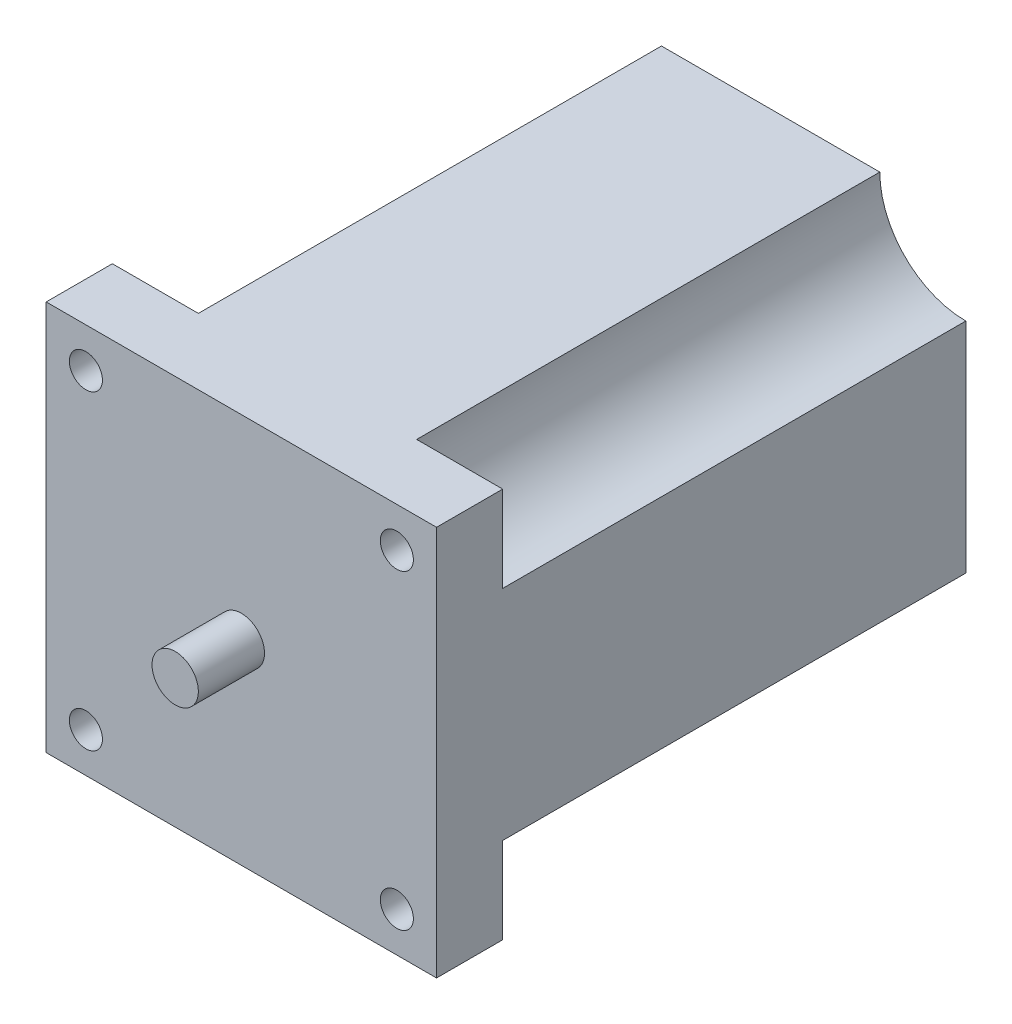
ISO-10303-21;
HEADER;
FILE_DESCRIPTION(('STEP AP214'),'2;1');
FILE_NAME('part.step','',(''),(''),'','','');
FILE_SCHEMA(('AUTOMOTIVE_DESIGN { 1 0 10303 214 1 1 1 1 }'));
ENDSEC;
DATA;
#1=APPLICATION_CONTEXT('core data for automotive mechanical design processes');
#2=APPLICATION_PROTOCOL_DEFINITION('international standard','automotive_design',2000,#1);
#3=PRODUCT_CONTEXT('',#1,'mechanical');
#4=PRODUCT('Part','Part','',(#3));
#5=PRODUCT_RELATED_PRODUCT_CATEGORY('part','',(#4));
#6=PRODUCT_DEFINITION_FORMATION('','',#4);
#7=PRODUCT_DEFINITION_CONTEXT('part definition',#1,'design');
#8=PRODUCT_DEFINITION('design','',#6,#7);
#9=PRODUCT_DEFINITION_SHAPE('','',#8);
#10=(LENGTH_UNIT() NAMED_UNIT(*) SI_UNIT(.MILLI.,.METRE.));
#11=(NAMED_UNIT(*) PLANE_ANGLE_UNIT() SI_UNIT($,.RADIAN.));
#12=(NAMED_UNIT(*) SI_UNIT($,.STERADIAN.) SOLID_ANGLE_UNIT());
#13=UNCERTAINTY_MEASURE_WITH_UNIT(LENGTH_MEASURE(1.E-05),#10,'distance_accuracy_value','');
#14=(GEOMETRIC_REPRESENTATION_CONTEXT(3) GLOBAL_UNCERTAINTY_ASSIGNED_CONTEXT((#13)) GLOBAL_UNIT_ASSIGNED_CONTEXT((#10,
#11,#12)) REPRESENTATION_CONTEXT('',''));
#15=CARTESIAN_POINT('',(0.,0.,0.));
#16=DIRECTION('',(0.,0.,1.));
#17=DIRECTION('',(1.,0.,0.));
#18=AXIS2_PLACEMENT_3D('',#15,#16,#17);
#19=CARTESIAN_POINT('',(0.,0.,0.));
#20=DIRECTION('',(0.,0.,-1.));
#21=DIRECTION('',(-1.,0.,0.));
#22=AXIS2_PLACEMENT_3D('',#19,#20,#21);
#23=PLANE('',#22);
#24=CARTESIAN_POINT('',(23.5,23.5,0.));
#25=DIRECTION('',(0.,0.,1.));
#26=DIRECTION('',(1.,0.,0.));
#27=AXIS2_PLACEMENT_3D('',#24,#25,#26);
#28=CIRCLE('',#27,2.5);
#29=CARTESIAN_POINT('',(26.,23.5,0.));
#30=VERTEX_POINT('',#29);
#31=EDGE_CURVE('E167',#30,#30,#28,.T.);
#32=ORIENTED_EDGE('',*,*,#31,.T.);
#33=EDGE_LOOP('',(#32));
#34=FACE_BOUND('',#33,.T.);
#35=CARTESIAN_POINT('',(29.5,29.5,0.));
#36=DIRECTION('',(0.,0.,1.));
#37=DIRECTION('',(-1.,0.,0.));
#38=AXIS2_PLACEMENT_3D('',#35,#36,#37);
#39=CIRCLE('',#38,13.);
#40=CARTESIAN_POINT('',(16.5,29.5,0.));
#41=VERTEX_POINT('',#40);
#42=CARTESIAN_POINT('',(29.5,16.5,0.));
#43=VERTEX_POINT('',#42);
#44=EDGE_CURVE('E59',#41,#43,#39,.T.);
#45=ORIENTED_EDGE('',*,*,#44,.F.);
#46=DIRECTION('',(-1.,0.,0.));
#47=VECTOR('',#46,1.);
#48=CARTESIAN_POINT('',(-29.5,29.5,0.));
#49=LINE('',#48,#47);
#50=CARTESIAN_POINT('',(29.5,29.5,0.));
#51=VERTEX_POINT('',#50);
#52=EDGE_CURVE('E194',#51,#41,#49,.T.);
#53=ORIENTED_EDGE('',*,*,#52,.F.);
#54=DIRECTION('',(0.,1.,0.));
#55=VECTOR('',#54,1.);
#56=CARTESIAN_POINT('',(29.5,-29.5,0.));
#57=LINE('',#56,#55);
#58=EDGE_CURVE('E178',#43,#51,#57,.T.);
#59=ORIENTED_EDGE('',*,*,#58,.F.);
#60=EDGE_LOOP('',(#45,#53,#59));
#61=FACE_BOUND('',#60,.T.);
#62=ADVANCED_FACE('F36',(#34,#61),#23,.T.);
#63=CARTESIAN_POINT('',(-23.5,23.5,0.));
#64=DIRECTION('',(0.,0.,1.));
#65=DIRECTION('',(1.,0.,0.));
#66=AXIS2_PLACEMENT_3D('',#63,#64,#65);
#67=CIRCLE('',#66,2.5);
#68=CARTESIAN_POINT('',(-21.,23.5,0.));
#69=VERTEX_POINT('',#68);
#70=EDGE_CURVE('E151',#69,#69,#67,.T.);
#71=ORIENTED_EDGE('',*,*,#70,.T.);
#72=EDGE_LOOP('',(#71));
#73=FACE_BOUND('',#72,.T.);
#74=CARTESIAN_POINT('',(-29.5,29.5,0.));
#75=DIRECTION('',(0.,0.,1.));
#76=DIRECTION('',(1.,0.,0.));
#77=AXIS2_PLACEMENT_3D('',#74,#75,#76);
#78=CIRCLE('',#77,13.);
#79=CARTESIAN_POINT('',(-29.5,16.5,0.));
#80=VERTEX_POINT('',#79);
#81=CARTESIAN_POINT('',(-16.5,29.5,0.));
#82=VERTEX_POINT('',#81);
#83=EDGE_CURVE('E145',#80,#82,#78,.T.);
#84=ORIENTED_EDGE('',*,*,#83,.F.);
#85=DIRECTION('',(0.,-1.,0.));
#86=VECTOR('',#85,1.);
#87=CARTESIAN_POINT('',(-29.5,-29.5,0.));
#88=LINE('',#87,#86);
#89=CARTESIAN_POINT('',(-29.5,29.5,0.));
#90=VERTEX_POINT('',#89);
#91=EDGE_CURVE('E197',#90,#80,#88,.T.);
#92=ORIENTED_EDGE('',*,*,#91,.F.);
#93=EDGE_CURVE('E51',#82,#90,#49,.T.);
#94=ORIENTED_EDGE('',*,*,#93,.F.);
#95=EDGE_LOOP('',(#84,#92,#94));
#96=FACE_BOUND('',#95,.T.);
#97=ADVANCED_FACE('F217',(#73,#96),#23,.T.);
#98=CARTESIAN_POINT('',(-23.5,-23.5,0.));
#99=DIRECTION('',(0.,0.,1.));
#100=DIRECTION('',(1.,0.,0.));
#101=AXIS2_PLACEMENT_3D('',#98,#99,#100);
#102=CIRCLE('',#101,2.5);
#103=CARTESIAN_POINT('',(-21.,-23.5,0.));
#104=VERTEX_POINT('',#103);
#105=EDGE_CURVE('E160',#104,#104,#102,.T.);
#106=ORIENTED_EDGE('',*,*,#105,.T.);
#107=EDGE_LOOP('',(#106));
#108=FACE_BOUND('',#107,.T.);
#109=CARTESIAN_POINT('',(-29.5,-29.5,0.));
#110=DIRECTION('',(0.,0.,1.));
#111=DIRECTION('',(-1.,0.,0.));
#112=AXIS2_PLACEMENT_3D('',#109,#110,#111);
#113=CIRCLE('',#112,13.);
#114=CARTESIAN_POINT('',(-16.5,-29.5,0.));
#115=VERTEX_POINT('',#114);
#116=CARTESIAN_POINT('',(-29.5,-16.5,0.));
#117=VERTEX_POINT('',#116);
#118=EDGE_CURVE('E243',#115,#117,#113,.T.);
#119=ORIENTED_EDGE('',*,*,#118,.F.);
#120=DIRECTION('',(1.,0.,0.));
#121=VECTOR('',#120,1.);
#122=CARTESIAN_POINT('',(-29.5,-29.5,0.));
#123=LINE('',#122,#121);
#124=CARTESIAN_POINT('',(-29.5,-29.5,0.));
#125=VERTEX_POINT('',#124);
#126=EDGE_CURVE('E185',#125,#115,#123,.T.);
#127=ORIENTED_EDGE('',*,*,#126,.F.);
#128=EDGE_CURVE('E196',#117,#125,#88,.T.);
#129=ORIENTED_EDGE('',*,*,#128,.F.);
#130=EDGE_LOOP('',(#119,#127,#129));
#131=FACE_BOUND('',#130,.T.);
#132=ADVANCED_FACE('F224',(#108,#131),#23,.T.);
#133=CARTESIAN_POINT('',(23.5,-23.5,0.));
#134=DIRECTION('',(0.,0.,1.));
#135=DIRECTION('',(1.,0.,0.));
#136=AXIS2_PLACEMENT_3D('',#133,#134,#135);
#137=CIRCLE('',#136,2.5);
#138=CARTESIAN_POINT('',(26.,-23.5,0.));
#139=VERTEX_POINT('',#138);
#140=EDGE_CURVE('E175',#139,#139,#137,.T.);
#141=ORIENTED_EDGE('',*,*,#140,.T.);
#142=EDGE_LOOP('',(#141));
#143=FACE_BOUND('',#142,.T.);
#144=CARTESIAN_POINT('',(29.5,-29.5,0.));
#145=DIRECTION('',(0.,0.,1.));
#146=DIRECTION('',(1.,0.,0.));
#147=AXIS2_PLACEMENT_3D('',#144,#145,#146);
#148=CIRCLE('',#147,13.);
#149=CARTESIAN_POINT('',(29.5,-16.5,0.));
#150=VERTEX_POINT('',#149);
#151=CARTESIAN_POINT('',(16.5,-29.5,0.));
#152=VERTEX_POINT('',#151);
#153=EDGE_CURVE('E239',#150,#152,#148,.T.);
#154=ORIENTED_EDGE('',*,*,#153,.F.);
#155=CARTESIAN_POINT('',(29.5,-29.5,0.));
#156=VERTEX_POINT('',#155);
#157=EDGE_CURVE('E192',#156,#150,#57,.T.);
#158=ORIENTED_EDGE('',*,*,#157,.F.);
#159=EDGE_CURVE('E200',#152,#156,#123,.T.);
#160=ORIENTED_EDGE('',*,*,#159,.F.);
#161=EDGE_LOOP('',(#154,#158,#160));
#162=FACE_BOUND('',#161,.T.);
#163=ADVANCED_FACE('F220',(#143,#162),#23,.T.);
#164=CARTESIAN_POINT('',(29.5,-29.5,10.));
#165=DIRECTION('',(-1.,0.,0.));
#166=DIRECTION('',(0.,0.,1.));
#167=AXIS2_PLACEMENT_3D('',#164,#165,#166);
#168=PLANE('',#167);
#169=ORIENTED_EDGE('',*,*,#157,.T.);
#170=DIRECTION('',(0.,0.,1.));
#171=VECTOR('',#170,1.);
#172=CARTESIAN_POINT('',(29.5,-16.5,-70.));
#173=LINE('',#172,#171);
#174=CARTESIAN_POINT('',(29.5,-16.5,-70.));
#175=VERTEX_POINT('',#174);
#176=EDGE_CURVE('E132',#175,#150,#173,.T.);
#177=ORIENTED_EDGE('',*,*,#176,.F.);
#178=DIRECTION('',(0.,-1.,0.));
#179=VECTOR('',#178,1.);
#180=CARTESIAN_POINT('',(29.5,16.5,-70.));
#181=LINE('',#180,#179);
#182=CARTESIAN_POINT('',(29.5,16.5,-70.));
#183=VERTEX_POINT('',#182);
#184=EDGE_CURVE('E126',#183,#175,#181,.T.);
#185=ORIENTED_EDGE('',*,*,#184,.F.);
#186=DIRECTION('',(0.,0.,1.));
#187=VECTOR('',#186,1.);
#188=CARTESIAN_POINT('',(29.5,16.5,-70.));
#189=LINE('',#188,#187);
#190=EDGE_CURVE('E130',#183,#43,#189,.T.);
#191=ORIENTED_EDGE('',*,*,#190,.T.);
#192=ORIENTED_EDGE('',*,*,#58,.T.);
#193=DIRECTION('',(0.,0.,-1.));
#194=VECTOR('',#193,1.);
#195=CARTESIAN_POINT('',(29.5,29.5,10.));
#196=LINE('',#195,#194);
#197=CARTESIAN_POINT('',(29.5,29.5,10.));
#198=VERTEX_POINT('',#197);
#199=EDGE_CURVE('E44',#198,#51,#196,.T.);
#200=ORIENTED_EDGE('',*,*,#199,.F.);
#201=DIRECTION('',(0.,1.,0.));
#202=VECTOR('',#201,1.);
#203=CARTESIAN_POINT('',(29.5,-29.5,10.));
#204=LINE('',#203,#202);
#205=CARTESIAN_POINT('',(29.5,-29.5,10.));
#206=VERTEX_POINT('',#205);
#207=EDGE_CURVE('E181',#206,#198,#204,.T.);
#208=ORIENTED_EDGE('',*,*,#207,.F.);
#209=DIRECTION('',(0.,0.,-1.));
#210=VECTOR('',#209,1.);
#211=CARTESIAN_POINT('',(29.5,-29.5,10.));
#212=LINE('',#211,#210);
#213=EDGE_CURVE('E191',#206,#156,#212,.T.);
#214=ORIENTED_EDGE('',*,*,#213,.T.);
#215=EDGE_LOOP('',(#169,#177,#185,#191,#192,#200,#208,#214));
#216=FACE_BOUND('',#215,.T.);
#217=ADVANCED_FACE('F38',(#216),#168,.F.);
#218=CARTESIAN_POINT('',(-29.5,29.5,10.));
#219=DIRECTION('',(0.,-1.,0.));
#220=DIRECTION('',(0.,0.,-1.));
#221=AXIS2_PLACEMENT_3D('',#218,#219,#220);
#222=PLANE('',#221);
#223=ORIENTED_EDGE('',*,*,#52,.T.);
#224=DIRECTION('',(0.,0.,1.));
#225=VECTOR('',#224,1.);
#226=CARTESIAN_POINT('',(16.5,29.5,-70.));
#227=LINE('',#226,#225);
#228=CARTESIAN_POINT('',(16.5,29.5,-70.));
#229=VERTEX_POINT('',#228);
#230=EDGE_CURVE('E259',#229,#41,#227,.T.);
#231=ORIENTED_EDGE('',*,*,#230,.F.);
#232=DIRECTION('',(1.,0.,0.));
#233=VECTOR('',#232,1.);
#234=CARTESIAN_POINT('',(-16.5,29.5,-70.));
#235=LINE('',#234,#233);
#236=CARTESIAN_POINT('',(-16.5,29.5,-70.));
#237=VERTEX_POINT('',#236);
#238=EDGE_CURVE('E141',#237,#229,#235,.T.);
#239=ORIENTED_EDGE('',*,*,#238,.F.);
#240=DIRECTION('',(0.,0.,1.));
#241=VECTOR('',#240,1.);
#242=CARTESIAN_POINT('',(-16.5,29.5,-70.));
#243=LINE('',#242,#241);
#244=EDGE_CURVE('E265',#237,#82,#243,.T.);
#245=ORIENTED_EDGE('',*,*,#244,.T.);
#246=ORIENTED_EDGE('',*,*,#93,.T.);
#247=DIRECTION('',(0.,0.,-1.));
#248=VECTOR('',#247,1.);
#249=CARTESIAN_POINT('',(-29.5,29.5,10.));
#250=LINE('',#249,#248);
#251=CARTESIAN_POINT('',(-29.5,29.5,10.));
#252=VERTEX_POINT('',#251);
#253=EDGE_CURVE('E208',#252,#90,#250,.T.);
#254=ORIENTED_EDGE('',*,*,#253,.F.);
#255=DIRECTION('',(-1.,0.,0.));
#256=VECTOR('',#255,1.);
#257=CARTESIAN_POINT('',(-29.5,29.5,10.));
#258=LINE('',#257,#256);
#259=EDGE_CURVE('E184',#198,#252,#258,.T.);
#260=ORIENTED_EDGE('',*,*,#259,.F.);
#261=ORIENTED_EDGE('',*,*,#199,.T.);
#262=EDGE_LOOP('',(#223,#231,#239,#245,#246,#254,#260,#261));
#263=FACE_BOUND('',#262,.T.);
#264=ADVANCED_FACE('F213',(#263),#222,.F.);
#265=CARTESIAN_POINT('',(-29.5,-29.5,10.));
#266=DIRECTION('',(1.,0.,0.));
#267=DIRECTION('',(0.,0.,-1.));
#268=AXIS2_PLACEMENT_3D('',#265,#266,#267);
#269=PLANE('',#268);
#270=ORIENTED_EDGE('',*,*,#91,.T.);
#271=DIRECTION('',(0.,0.,1.));
#272=VECTOR('',#271,1.);
#273=CARTESIAN_POINT('',(-29.5,16.5,-70.));
#274=LINE('',#273,#272);
#275=CARTESIAN_POINT('',(-29.5,16.5,-70.));
#276=VERTEX_POINT('',#275);
#277=EDGE_CURVE('E268',#276,#80,#274,.T.);
#278=ORIENTED_EDGE('',*,*,#277,.F.);
#279=DIRECTION('',(0.,1.,0.));
#280=VECTOR('',#279,1.);
#281=CARTESIAN_POINT('',(-29.5,-16.5,-70.));
#282=LINE('',#281,#280);
#283=CARTESIAN_POINT('',(-29.5,-16.5,-70.));
#284=VERTEX_POINT('',#283);
#285=EDGE_CURVE('E254',#284,#276,#282,.T.);
#286=ORIENTED_EDGE('',*,*,#285,.F.);
#287=DIRECTION('',(0.,0.,1.));
#288=VECTOR('',#287,1.);
#289=CARTESIAN_POINT('',(-29.5,-16.5,-70.));
#290=LINE('',#289,#288);
#291=EDGE_CURVE('E271',#284,#117,#290,.T.);
#292=ORIENTED_EDGE('',*,*,#291,.T.);
#293=ORIENTED_EDGE('',*,*,#128,.T.);
#294=DIRECTION('',(0.,0.,-1.));
#295=VECTOR('',#294,1.);
#296=CARTESIAN_POINT('',(-29.5,-29.5,10.));
#297=LINE('',#296,#295);
#298=CARTESIAN_POINT('',(-29.5,-29.5,10.));
#299=VERTEX_POINT('',#298);
#300=EDGE_CURVE('E205',#299,#125,#297,.T.);
#301=ORIENTED_EDGE('',*,*,#300,.F.);
#302=DIRECTION('',(0.,-1.,0.));
#303=VECTOR('',#302,1.);
#304=CARTESIAN_POINT('',(-29.5,-29.5,10.));
#305=LINE('',#304,#303);
#306=EDGE_CURVE('E187',#252,#299,#305,.T.);
#307=ORIENTED_EDGE('',*,*,#306,.F.);
#308=ORIENTED_EDGE('',*,*,#253,.T.);
#309=EDGE_LOOP('',(#270,#278,#286,#292,#293,#301,#307,#308));
#310=FACE_BOUND('',#309,.T.);
#311=ADVANCED_FACE('F286',(#310),#269,.F.);
#312=CARTESIAN_POINT('',(-29.5,-29.5,10.));
#313=DIRECTION('',(0.,1.,0.));
#314=DIRECTION('',(0.,0.,1.));
#315=AXIS2_PLACEMENT_3D('',#312,#313,#314);
#316=PLANE('',#315);
#317=ORIENTED_EDGE('',*,*,#126,.T.);
#318=DIRECTION('',(0.,0.,1.));
#319=VECTOR('',#318,1.);
#320=CARTESIAN_POINT('',(-16.5,-29.5,-70.));
#321=LINE('',#320,#319);
#322=CARTESIAN_POINT('',(-16.5,-29.5,-70.));
#323=VERTEX_POINT('',#322);
#324=EDGE_CURVE('E274',#323,#115,#321,.T.);
#325=ORIENTED_EDGE('',*,*,#324,.F.);
#326=DIRECTION('',(-1.,0.,0.));
#327=VECTOR('',#326,1.);
#328=CARTESIAN_POINT('',(16.5,-29.5,-70.));
#329=LINE('',#328,#327);
#330=CARTESIAN_POINT('',(16.5,-29.5,-70.));
#331=VERTEX_POINT('',#330);
#332=EDGE_CURVE('E248',#331,#323,#329,.T.);
#333=ORIENTED_EDGE('',*,*,#332,.F.);
#334=DIRECTION('',(0.,0.,1.));
#335=VECTOR('',#334,1.);
#336=CARTESIAN_POINT('',(16.5,-29.5,-70.));
#337=LINE('',#336,#335);
#338=EDGE_CURVE('E153',#331,#152,#337,.T.);
#339=ORIENTED_EDGE('',*,*,#338,.T.);
#340=ORIENTED_EDGE('',*,*,#159,.T.);
#341=ORIENTED_EDGE('',*,*,#213,.F.);
#342=DIRECTION('',(1.,0.,0.));
#343=VECTOR('',#342,1.);
#344=CARTESIAN_POINT('',(-29.5,-29.5,10.));
#345=LINE('',#344,#343);
#346=EDGE_CURVE('E189',#299,#206,#345,.T.);
#347=ORIENTED_EDGE('',*,*,#346,.F.);
#348=ORIENTED_EDGE('',*,*,#300,.T.);
#349=EDGE_LOOP('',(#317,#325,#333,#339,#340,#341,#347,#348));
#350=FACE_BOUND('',#349,.T.);
#351=ADVANCED_FACE('F277',(#350),#316,.F.);
#352=CARTESIAN_POINT('',(0.,0.,10.));
#353=DIRECTION('',(0.,0.,-1.));
#354=DIRECTION('',(-1.,0.,0.));
#355=AXIS2_PLACEMENT_3D('',#352,#353,#354);
#356=PLANE('',#355);
#357=CARTESIAN_POINT('',(0.,0.,10.));
#358=DIRECTION('',(0.,0.,-1.));
#359=DIRECTION('',(-1.,0.,0.));
#360=AXIS2_PLACEMENT_3D('',#357,#358,#359);
#361=CIRCLE('',#360,3.5);
#362=CARTESIAN_POINT('',(-3.5,0.,10.));
#363=VERTEX_POINT('',#362);
#364=EDGE_CURVE('E11',#363,#363,#361,.F.);
#365=ORIENTED_EDGE('',*,*,#364,.F.);
#366=EDGE_LOOP('',(#365));
#367=FACE_BOUND('',#366,.T.);
#368=CARTESIAN_POINT('',(23.5,23.5,10.));
#369=DIRECTION('',(0.,0.,1.));
#370=DIRECTION('',(1.,0.,0.));
#371=AXIS2_PLACEMENT_3D('',#368,#369,#370);
#372=CIRCLE('',#371,2.5);
#373=CARTESIAN_POINT('',(26.,23.5,10.));
#374=VERTEX_POINT('',#373);
#375=EDGE_CURVE('E163',#374,#374,#372,.T.);
#376=ORIENTED_EDGE('',*,*,#375,.F.);
#377=EDGE_LOOP('',(#376));
#378=FACE_BOUND('',#377,.T.);
#379=CARTESIAN_POINT('',(-23.5,-23.5,10.));
#380=DIRECTION('',(0.,0.,1.));
#381=DIRECTION('',(1.,0.,0.));
#382=AXIS2_PLACEMENT_3D('',#379,#380,#381);
#383=CIRCLE('',#382,2.5);
#384=CARTESIAN_POINT('',(-21.,-23.5,10.));
#385=VERTEX_POINT('',#384);
#386=EDGE_CURVE('E170',#385,#385,#383,.T.);
#387=ORIENTED_EDGE('',*,*,#386,.F.);
#388=EDGE_LOOP('',(#387));
#389=FACE_BOUND('',#388,.T.);
#390=CARTESIAN_POINT('',(-23.5,23.5,10.));
#391=DIRECTION('',(0.,0.,1.));
#392=DIRECTION('',(1.,0.,0.));
#393=AXIS2_PLACEMENT_3D('',#390,#391,#392);
#394=CIRCLE('',#393,2.5);
#395=CARTESIAN_POINT('',(-21.,23.5,10.));
#396=VERTEX_POINT('',#395);
#397=EDGE_CURVE('E157',#396,#396,#394,.T.);
#398=ORIENTED_EDGE('',*,*,#397,.F.);
#399=EDGE_LOOP('',(#398));
#400=FACE_BOUND('',#399,.T.);
#401=CARTESIAN_POINT('',(23.5,-23.5,10.));
#402=DIRECTION('',(0.,0.,1.));
#403=DIRECTION('',(1.,0.,0.));
#404=AXIS2_PLACEMENT_3D('',#401,#402,#403);
#405=CIRCLE('',#404,2.5);
#406=CARTESIAN_POINT('',(26.,-23.5,10.));
#407=VERTEX_POINT('',#406);
#408=EDGE_CURVE('E166',#407,#407,#405,.T.);
#409=ORIENTED_EDGE('',*,*,#408,.F.);
#410=EDGE_LOOP('',(#409));
#411=FACE_BOUND('',#410,.T.);
#412=ORIENTED_EDGE('',*,*,#207,.T.);
#413=ORIENTED_EDGE('',*,*,#259,.T.);
#414=ORIENTED_EDGE('',*,*,#306,.T.);
#415=ORIENTED_EDGE('',*,*,#346,.T.);
#416=EDGE_LOOP('',(#412,#413,#414,#415));
#417=FACE_BOUND('',#416,.T.);
#418=ADVANCED_FACE('F295',(#367,#378,#389,#400,#411,#417),#356,.F.);
#419=CARTESIAN_POINT('',(23.5,-23.5,0.));
#420=DIRECTION('',(0.,0.,1.));
#421=DIRECTION('',(1.,0.,0.));
#422=AXIS2_PLACEMENT_3D('',#419,#420,#421);
#423=CYLINDRICAL_SURFACE('',#422,2.5);
#424=ORIENTED_EDGE('',*,*,#140,.F.);
#425=EDGE_LOOP('',(#424));
#426=FACE_BOUND('',#425,.T.);
#427=ORIENTED_EDGE('',*,*,#408,.T.);
#428=EDGE_LOOP('',(#427));
#429=FACE_BOUND('',#428,.T.);
#430=ADVANCED_FACE('F299',(#426,#429),#423,.F.);
#431=CARTESIAN_POINT('',(-23.5,23.5,0.));
#432=DIRECTION('',(0.,0.,1.));
#433=DIRECTION('',(1.,0.,0.));
#434=AXIS2_PLACEMENT_3D('',#431,#432,#433);
#435=CYLINDRICAL_SURFACE('',#434,2.5);
#436=ORIENTED_EDGE('',*,*,#70,.F.);
#437=EDGE_LOOP('',(#436));
#438=FACE_BOUND('',#437,.T.);
#439=ORIENTED_EDGE('',*,*,#397,.T.);
#440=EDGE_LOOP('',(#439));
#441=FACE_BOUND('',#440,.T.);
#442=ADVANCED_FACE('F305',(#438,#441),#435,.F.);
#443=CARTESIAN_POINT('',(-23.5,-23.5,0.));
#444=DIRECTION('',(0.,0.,1.));
#445=DIRECTION('',(1.,0.,0.));
#446=AXIS2_PLACEMENT_3D('',#443,#444,#445);
#447=CYLINDRICAL_SURFACE('',#446,2.5);
#448=ORIENTED_EDGE('',*,*,#105,.F.);
#449=EDGE_LOOP('',(#448));
#450=FACE_BOUND('',#449,.T.);
#451=ORIENTED_EDGE('',*,*,#386,.T.);
#452=EDGE_LOOP('',(#451));
#453=FACE_BOUND('',#452,.T.);
#454=ADVANCED_FACE('F311',(#450,#453),#447,.F.);
#455=CARTESIAN_POINT('',(23.5,23.5,0.));
#456=DIRECTION('',(0.,0.,1.));
#457=DIRECTION('',(1.,0.,0.));
#458=AXIS2_PLACEMENT_3D('',#455,#456,#457);
#459=CYLINDRICAL_SURFACE('',#458,2.5);
#460=ORIENTED_EDGE('',*,*,#31,.F.);
#461=EDGE_LOOP('',(#460));
#462=FACE_BOUND('',#461,.T.);
#463=ORIENTED_EDGE('',*,*,#375,.T.);
#464=EDGE_LOOP('',(#463));
#465=FACE_BOUND('',#464,.T.);
#466=ADVANCED_FACE('F314',(#462,#465),#459,.F.);
#467=CARTESIAN_POINT('',(0.,0.,20.));
#468=DIRECTION('',(0.,0.,-1.));
#469=DIRECTION('',(-1.,0.,0.));
#470=AXIS2_PLACEMENT_3D('',#467,#468,#469);
#471=CYLINDRICAL_SURFACE('',#470,3.5);
#472=CARTESIAN_POINT('',(0.,0.,20.));
#473=DIRECTION('',(0.,0.,1.));
#474=DIRECTION('',(1.,0.,0.));
#475=AXIS2_PLACEMENT_3D('',#472,#473,#474);
#476=CIRCLE('',#475,3.5);
#477=CARTESIAN_POINT('',(3.5,0.,20.));
#478=VERTEX_POINT('',#477);
#479=EDGE_CURVE('E148',#478,#478,#476,.T.);
#480=ORIENTED_EDGE('',*,*,#479,.F.);
#481=EDGE_LOOP('',(#480));
#482=FACE_BOUND('',#481,.T.);
#483=ORIENTED_EDGE('',*,*,#364,.T.);
#484=EDGE_LOOP('',(#483));
#485=FACE_BOUND('',#484,.T.);
#486=ADVANCED_FACE('F318',(#482,#485),#471,.T.);
#487=CARTESIAN_POINT('',(0.,0.,20.));
#488=DIRECTION('',(0.,0.,1.));
#489=DIRECTION('',(1.,0.,0.));
#490=AXIS2_PLACEMENT_3D('',#487,#488,#489);
#491=PLANE('',#490);
#492=ORIENTED_EDGE('',*,*,#479,.T.);
#493=EDGE_LOOP('',(#492));
#494=FACE_BOUND('',#493,.T.);
#495=ADVANCED_FACE('F325',(#494),#491,.T.);
#496=CARTESIAN_POINT('',(29.5,29.5,-70.));
#497=DIRECTION('',(0.,0.,1.));
#498=DIRECTION('',(1.,0.,0.));
#499=AXIS2_PLACEMENT_3D('',#496,#497,#498);
#500=CYLINDRICAL_SURFACE('',#499,13.);
#501=ORIENTED_EDGE('',*,*,#44,.T.);
#502=ORIENTED_EDGE('',*,*,#190,.F.);
#503=CARTESIAN_POINT('',(29.5,29.5,-70.));
#504=DIRECTION('',(0.,0.,1.));
#505=DIRECTION('',(-1.,0.,0.));
#506=AXIS2_PLACEMENT_3D('',#503,#504,#505);
#507=CIRCLE('',#506,13.);
#508=EDGE_CURVE('E136',#229,#183,#507,.T.);
#509=ORIENTED_EDGE('',*,*,#508,.F.);
#510=ORIENTED_EDGE('',*,*,#230,.T.);
#511=EDGE_LOOP('',(#501,#502,#509,#510));
#512=FACE_BOUND('',#511,.T.);
#513=ADVANCED_FACE('F147',(#512),#500,.F.);
#514=CARTESIAN_POINT('',(29.5,-29.5,-70.));
#515=DIRECTION('',(0.,0.,1.));
#516=DIRECTION('',(1.,0.,0.));
#517=AXIS2_PLACEMENT_3D('',#514,#515,#516);
#518=CYLINDRICAL_SURFACE('',#517,13.);
#519=ORIENTED_EDGE('',*,*,#153,.T.);
#520=ORIENTED_EDGE('',*,*,#338,.F.);
#521=CARTESIAN_POINT('',(29.5,-29.5,-70.));
#522=DIRECTION('',(0.,0.,1.));
#523=DIRECTION('',(1.,0.,0.));
#524=AXIS2_PLACEMENT_3D('',#521,#522,#523);
#525=CIRCLE('',#524,13.);
#526=EDGE_CURVE('E135',#175,#331,#525,.T.);
#527=ORIENTED_EDGE('',*,*,#526,.F.);
#528=ORIENTED_EDGE('',*,*,#176,.T.);
#529=EDGE_LOOP('',(#519,#520,#527,#528));
#530=FACE_BOUND('',#529,.T.);
#531=ADVANCED_FACE('F246',(#530),#518,.F.);
#532=CARTESIAN_POINT('',(-29.5,-29.5,-70.));
#533=DIRECTION('',(0.,0.,1.));
#534=DIRECTION('',(1.,0.,0.));
#535=AXIS2_PLACEMENT_3D('',#532,#533,#534);
#536=CYLINDRICAL_SURFACE('',#535,13.);
#537=ORIENTED_EDGE('',*,*,#118,.T.);
#538=ORIENTED_EDGE('',*,*,#291,.F.);
#539=CARTESIAN_POINT('',(-29.5,-29.5,-70.));
#540=DIRECTION('',(0.,0.,1.));
#541=DIRECTION('',(-1.,0.,0.));
#542=AXIS2_PLACEMENT_3D('',#539,#540,#541);
#543=CIRCLE('',#542,13.);
#544=EDGE_CURVE('E250',#323,#284,#543,.T.);
#545=ORIENTED_EDGE('',*,*,#544,.F.);
#546=ORIENTED_EDGE('',*,*,#324,.T.);
#547=EDGE_LOOP('',(#537,#538,#545,#546));
#548=FACE_BOUND('',#547,.T.);
#549=ADVANCED_FACE('F284',(#548),#536,.F.);
#550=CARTESIAN_POINT('',(-29.5,29.5,-70.));
#551=DIRECTION('',(0.,0.,1.));
#552=DIRECTION('',(1.,0.,0.));
#553=AXIS2_PLACEMENT_3D('',#550,#551,#552);
#554=CYLINDRICAL_SURFACE('',#553,13.);
#555=ORIENTED_EDGE('',*,*,#83,.T.);
#556=ORIENTED_EDGE('',*,*,#244,.F.);
#557=CARTESIAN_POINT('',(-29.5,29.5,-70.));
#558=DIRECTION('',(0.,0.,1.));
#559=DIRECTION('',(1.,0.,0.));
#560=AXIS2_PLACEMENT_3D('',#557,#558,#559);
#561=CIRCLE('',#560,13.);
#562=EDGE_CURVE('E256',#276,#237,#561,.T.);
#563=ORIENTED_EDGE('',*,*,#562,.F.);
#564=ORIENTED_EDGE('',*,*,#277,.T.);
#565=EDGE_LOOP('',(#555,#556,#563,#564));
#566=FACE_BOUND('',#565,.T.);
#567=ADVANCED_FACE('F290',(#566),#554,.F.);
#568=CARTESIAN_POINT('',(29.5,29.5,-70.));
#569=DIRECTION('',(0.,0.,-1.));
#570=DIRECTION('',(-1.,0.,0.));
#571=AXIS2_PLACEMENT_3D('',#568,#569,#570);
#572=PLANE('',#571);
#573=ORIENTED_EDGE('',*,*,#508,.T.);
#574=ORIENTED_EDGE('',*,*,#184,.T.);
#575=ORIENTED_EDGE('',*,*,#526,.T.);
#576=ORIENTED_EDGE('',*,*,#332,.T.);
#577=ORIENTED_EDGE('',*,*,#544,.T.);
#578=ORIENTED_EDGE('',*,*,#285,.T.);
#579=ORIENTED_EDGE('',*,*,#562,.T.);
#580=ORIENTED_EDGE('',*,*,#238,.T.);
#581=EDGE_LOOP('',(#573,#574,#575,#576,#577,#578,#579,#580));
#582=FACE_BOUND('',#581,.T.);
#583=ADVANCED_FACE('F139',(#582),#572,.T.);
#584=CLOSED_SHELL('',(#62,#97,#132,#163,#217,#264,#311,#351,#418,#430,#442,#454,#466,#486,#495,
#513,#531,#549,#567,#583));
#585=MANIFOLD_SOLID_BREP('B2',#584);
#586=ADVANCED_BREP_SHAPE_REPRESENTATION('',(#18,#585),#14);
#587=SHAPE_DEFINITION_REPRESENTATION(#9,#586);
ENDSEC;
END-ISO-10303-21;
